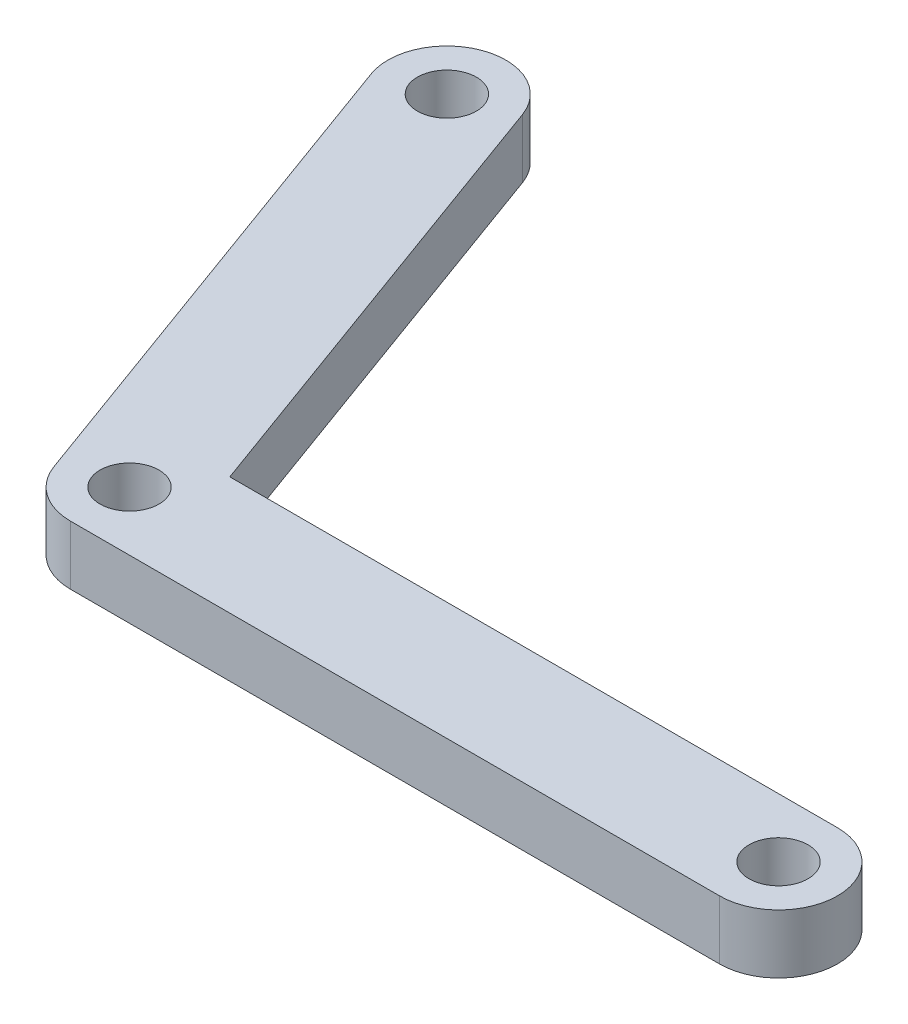
ISO-10303-21;
HEADER;
FILE_DESCRIPTION(('STEP AP214'),'2;1');
FILE_NAME('part.step','',(''),(''),'','','');
FILE_SCHEMA(('AUTOMOTIVE_DESIGN { 1 0 10303 214 1 1 1 1 }'));
ENDSEC;
DATA;
#1=APPLICATION_CONTEXT('core data for automotive mechanical design processes');
#2=APPLICATION_PROTOCOL_DEFINITION('international standard','automotive_design',2000,#1);
#3=PRODUCT_CONTEXT('',#1,'mechanical');
#4=PRODUCT('Part','Part','',(#3));
#5=PRODUCT_RELATED_PRODUCT_CATEGORY('part','',(#4));
#6=PRODUCT_DEFINITION_FORMATION('','',#4);
#7=PRODUCT_DEFINITION_CONTEXT('part definition',#1,'design');
#8=PRODUCT_DEFINITION('design','',#6,#7);
#9=PRODUCT_DEFINITION_SHAPE('','',#8);
#10=(LENGTH_UNIT() NAMED_UNIT(*) SI_UNIT(.MILLI.,.METRE.));
#11=(NAMED_UNIT(*) PLANE_ANGLE_UNIT() SI_UNIT($,.RADIAN.));
#12=(NAMED_UNIT(*) SI_UNIT($,.STERADIAN.) SOLID_ANGLE_UNIT());
#13=UNCERTAINTY_MEASURE_WITH_UNIT(LENGTH_MEASURE(1.E-05),#10,'distance_accuracy_value','');
#14=(GEOMETRIC_REPRESENTATION_CONTEXT(3) GLOBAL_UNCERTAINTY_ASSIGNED_CONTEXT((#13)) GLOBAL_UNIT_ASSIGNED_CONTEXT((#10,
#11,#12)) REPRESENTATION_CONTEXT('',''));
#15=CARTESIAN_POINT('',(0.,0.,0.));
#16=DIRECTION('',(0.,0.,1.));
#17=DIRECTION('',(1.,0.,0.));
#18=AXIS2_PLACEMENT_3D('',#15,#16,#17);
#19=CARTESIAN_POINT('',(-4.69846310392954,5.,1.71010071662837));
#20=DIRECTION('',(-0.939692620785907,0.,0.342020143325673));
#21=DIRECTION('',(0.342020143325673,0.,0.939692620785907));
#22=AXIS2_PLACEMENT_3D('',#19,#20,#21);
#23=PLANE('',#22);
#24=DIRECTION('',(-0.342020143325673,0.,-0.939692620785907));
#25=VECTOR('',#24,1.);
#26=CARTESIAN_POINT('',(-4.69846310392954,0.,1.71010071662837));
#27=LINE('',#26,#25);
#28=CARTESIAN_POINT('',(-4.69846310392954,0.,1.71010071662836));
#29=VERTEX_POINT('',#28);
#30=CARTESIAN_POINT('',(-20.0893695535848,0.,-40.5760672187374));
#31=VERTEX_POINT('',#30);
#32=EDGE_CURVE('E123',#29,#31,#27,.T.);
#33=ORIENTED_EDGE('',*,*,#32,.F.);
#34=DIRECTION('',(0.,-1.,0.));
#35=VECTOR('',#34,1.);
#36=CARTESIAN_POINT('',(-4.69846310392954,5.,1.71010071662836));
#37=LINE('',#36,#35);
#38=CARTESIAN_POINT('',(-4.69846310392954,5.,1.71010071662836));
#39=VERTEX_POINT('',#38);
#40=EDGE_CURVE('E11',#39,#29,#37,.T.);
#41=ORIENTED_EDGE('',*,*,#40,.F.);
#42=DIRECTION('',(-0.342020143325673,0.,-0.939692620785907));
#43=VECTOR('',#42,1.);
#44=CARTESIAN_POINT('',(-4.69846310392954,5.,1.71010071662837));
#45=LINE('',#44,#43);
#46=CARTESIAN_POINT('',(-20.0893695535848,5.,-40.5760672187374));
#47=VERTEX_POINT('',#46);
#48=EDGE_CURVE('E138',#39,#47,#45,.T.);
#49=ORIENTED_EDGE('',*,*,#48,.T.);
#50=DIRECTION('',(0.,-1.,0.));
#51=VECTOR('',#50,1.);
#52=CARTESIAN_POINT('',(-20.0893695535848,5.,-40.5760672187374));
#53=LINE('',#52,#51);
#54=EDGE_CURVE('E82',#47,#31,#53,.T.);
#55=ORIENTED_EDGE('',*,*,#54,.T.);
#56=EDGE_LOOP('',(#33,#41,#49,#55));
#57=FACE_BOUND('',#56,.T.);
#58=ADVANCED_FACE('F35',(#57),#23,.T.);
#59=CARTESIAN_POINT('',(0.,5.,0.));
#60=DIRECTION('',(0.,-1.,0.));
#61=DIRECTION('',(0.,0.,-1.));
#62=AXIS2_PLACEMENT_3D('',#59,#60,#61);
#63=CYLINDRICAL_SURFACE('',#62,5.);
#64=CARTESIAN_POINT('',(0.,0.,0.));
#65=DIRECTION('',(0.,1.,0.));
#66=DIRECTION('',(0.,0.,1.));
#67=AXIS2_PLACEMENT_3D('',#64,#65,#66);
#68=CIRCLE('',#67,5.);
#69=CARTESIAN_POINT('',(0.,0.,5.));
#70=VERTEX_POINT('',#69);
#71=EDGE_CURVE('E126',#29,#70,#68,.T.);
#72=ORIENTED_EDGE('',*,*,#71,.T.);
#73=DIRECTION('',(0.,-1.,0.));
#74=VECTOR('',#73,1.);
#75=CARTESIAN_POINT('',(0.,5.,5.));
#76=LINE('',#75,#74);
#77=CARTESIAN_POINT('',(0.,5.,5.));
#78=VERTEX_POINT('',#77);
#79=EDGE_CURVE('E43',#78,#70,#76,.T.);
#80=ORIENTED_EDGE('',*,*,#79,.F.);
#81=CARTESIAN_POINT('',(0.,5.,0.));
#82=DIRECTION('',(0.,1.,0.));
#83=DIRECTION('',(0.,0.,1.));
#84=AXIS2_PLACEMENT_3D('',#81,#82,#83);
#85=CIRCLE('',#84,5.);
#86=EDGE_CURVE('E174',#39,#78,#85,.T.);
#87=ORIENTED_EDGE('',*,*,#86,.F.);
#88=ORIENTED_EDGE('',*,*,#40,.T.);
#89=EDGE_LOOP('',(#72,#80,#87,#88));
#90=FACE_BOUND('',#89,.T.);
#91=ADVANCED_FACE('F165',(#90),#63,.T.);
#92=CARTESIAN_POINT('',(0.,5.,5.));
#93=DIRECTION('',(0.,0.,-1.));
#94=DIRECTION('',(-1.,0.,0.));
#95=AXIS2_PLACEMENT_3D('',#92,#93,#94);
#96=PLANE('',#95);
#97=DIRECTION('',(1.,0.,0.));
#98=VECTOR('',#97,1.);
#99=CARTESIAN_POINT('',(0.,0.,5.));
#100=LINE('',#99,#98);
#101=CARTESIAN_POINT('',(55.,0.,5.));
#102=VERTEX_POINT('',#101);
#103=EDGE_CURVE('E129',#70,#102,#100,.T.);
#104=ORIENTED_EDGE('',*,*,#103,.T.);
#105=DIRECTION('',(0.,-1.,0.));
#106=VECTOR('',#105,1.);
#107=CARTESIAN_POINT('',(55.,5.,5.));
#108=LINE('',#107,#106);
#109=CARTESIAN_POINT('',(55.,5.,5.));
#110=VERTEX_POINT('',#109);
#111=EDGE_CURVE('E142',#110,#102,#108,.T.);
#112=ORIENTED_EDGE('',*,*,#111,.F.);
#113=DIRECTION('',(1.,0.,0.));
#114=VECTOR('',#113,1.);
#115=CARTESIAN_POINT('',(0.,5.,5.));
#116=LINE('',#115,#114);
#117=EDGE_CURVE('E118',#78,#110,#116,.T.);
#118=ORIENTED_EDGE('',*,*,#117,.F.);
#119=ORIENTED_EDGE('',*,*,#79,.T.);
#120=EDGE_LOOP('',(#104,#112,#118,#119));
#121=FACE_BOUND('',#120,.T.);
#122=ADVANCED_FACE('F149',(#121),#96,.F.);
#123=CARTESIAN_POINT('',(55.,5.,0.));
#124=DIRECTION('',(0.,-1.,0.));
#125=DIRECTION('',(0.,0.,-1.));
#126=AXIS2_PLACEMENT_3D('',#123,#124,#125);
#127=CYLINDRICAL_SURFACE('',#126,5.);
#128=CARTESIAN_POINT('',(55.,0.,0.));
#129=DIRECTION('',(0.,1.,0.));
#130=DIRECTION('',(0.,0.,1.));
#131=AXIS2_PLACEMENT_3D('',#128,#129,#130);
#132=CIRCLE('',#131,5.);
#133=CARTESIAN_POINT('',(55.,0.,-5.));
#134=VERTEX_POINT('',#133);
#135=EDGE_CURVE('E131',#102,#134,#132,.T.);
#136=ORIENTED_EDGE('',*,*,#135,.T.);
#137=DIRECTION('',(0.,-1.,0.));
#138=VECTOR('',#137,1.);
#139=CARTESIAN_POINT('',(55.,5.,-5.));
#140=LINE('',#139,#138);
#141=CARTESIAN_POINT('',(55.,5.,-5.));
#142=VERTEX_POINT('',#141);
#143=EDGE_CURVE('E107',#142,#134,#140,.T.);
#144=ORIENTED_EDGE('',*,*,#143,.F.);
#145=CARTESIAN_POINT('',(55.,5.,0.));
#146=DIRECTION('',(0.,1.,0.));
#147=DIRECTION('',(0.,0.,1.));
#148=AXIS2_PLACEMENT_3D('',#145,#146,#147);
#149=CIRCLE('',#148,5.);
#150=EDGE_CURVE('E115',#110,#142,#149,.T.);
#151=ORIENTED_EDGE('',*,*,#150,.F.);
#152=ORIENTED_EDGE('',*,*,#111,.T.);
#153=EDGE_LOOP('',(#136,#144,#151,#152));
#154=FACE_BOUND('',#153,.T.);
#155=ADVANCED_FACE('F157',(#154),#127,.T.);
#156=CARTESIAN_POINT('',(0.,5.,-5.));
#157=DIRECTION('',(0.,0.,-1.));
#158=DIRECTION('',(-1.,0.,0.));
#159=AXIS2_PLACEMENT_3D('',#156,#157,#158);
#160=PLANE('',#159);
#161=DIRECTION('',(1.,0.,0.));
#162=VECTOR('',#161,1.);
#163=CARTESIAN_POINT('',(0.,0.,-5.));
#164=LINE('',#163,#162);
#165=CARTESIAN_POINT('',(3.50103769104853,0.,-5.));
#166=VERTEX_POINT('',#165);
#167=EDGE_CURVE('E106',#166,#134,#164,.T.);
#168=ORIENTED_EDGE('',*,*,#167,.F.);
#169=DIRECTION('',(0.,-1.,0.));
#170=VECTOR('',#169,1.);
#171=CARTESIAN_POINT('',(3.50103769104853,5.,-5.));
#172=LINE('',#171,#170);
#173=CARTESIAN_POINT('',(3.50103769104853,5.,-5.));
#174=VERTEX_POINT('',#173);
#175=EDGE_CURVE('E100',#174,#166,#172,.T.);
#176=ORIENTED_EDGE('',*,*,#175,.F.);
#177=DIRECTION('',(1.,0.,0.));
#178=VECTOR('',#177,1.);
#179=CARTESIAN_POINT('',(0.,5.,-5.));
#180=LINE('',#179,#178);
#181=EDGE_CURVE('E104',#174,#142,#180,.T.);
#182=ORIENTED_EDGE('',*,*,#181,.T.);
#183=ORIENTED_EDGE('',*,*,#143,.T.);
#184=EDGE_LOOP('',(#168,#176,#182,#183));
#185=FACE_BOUND('',#184,.T.);
#186=ADVANCED_FACE('F102',(#185),#160,.T.);
#187=CARTESIAN_POINT('',(4.69846310392954,5.,-1.71010071662836));
#188=DIRECTION('',(-0.939692620785907,0.,0.342020143325673));
#189=DIRECTION('',(0.342020143325673,0.,0.939692620785907));
#190=AXIS2_PLACEMENT_3D('',#187,#188,#189);
#191=PLANE('',#190);
#192=DIRECTION('',(-0.342020143325673,0.,-0.939692620785907));
#193=VECTOR('',#192,1.);
#194=CARTESIAN_POINT('',(4.69846310392954,0.,-1.71010071662836));
#195=LINE('',#194,#193);
#196=CARTESIAN_POINT('',(-10.6924433457257,0.,-43.9962686519942));
#197=VERTEX_POINT('',#196);
#198=EDGE_CURVE('E75',#166,#197,#195,.T.);
#199=ORIENTED_EDGE('',*,*,#198,.T.);
#200=DIRECTION('',(0.,-1.,0.));
#201=VECTOR('',#200,1.);
#202=CARTESIAN_POINT('',(-10.6924433457257,5.,-43.9962686519942));
#203=LINE('',#202,#201);
#204=CARTESIAN_POINT('',(-10.6924433457257,5.,-43.9962686519942));
#205=VERTEX_POINT('',#204);
#206=EDGE_CURVE('E108',#205,#197,#203,.T.);
#207=ORIENTED_EDGE('',*,*,#206,.F.);
#208=DIRECTION('',(-0.342020143325673,0.,-0.939692620785907));
#209=VECTOR('',#208,1.);
#210=CARTESIAN_POINT('',(4.69846310392954,5.,-1.71010071662836));
#211=LINE('',#210,#209);
#212=EDGE_CURVE('E110',#174,#205,#211,.T.);
#213=ORIENTED_EDGE('',*,*,#212,.F.);
#214=ORIENTED_EDGE('',*,*,#175,.T.);
#215=EDGE_LOOP('',(#199,#207,#213,#214));
#216=FACE_BOUND('',#215,.T.);
#217=ADVANCED_FACE('F111',(#216),#191,.F.);
#218=CARTESIAN_POINT('',(-15.3909064496553,5.,-42.2861679353658));
#219=DIRECTION('',(0.,-1.,0.));
#220=DIRECTION('',(0.,0.,-1.));
#221=AXIS2_PLACEMENT_3D('',#218,#219,#220);
#222=CYLINDRICAL_SURFACE('',#221,5.);
#223=CARTESIAN_POINT('',(-15.3909064496553,0.,-42.2861679353658));
#224=DIRECTION('',(0.,1.,0.));
#225=DIRECTION('',(0.,0.,1.));
#226=AXIS2_PLACEMENT_3D('',#223,#224,#225);
#227=CIRCLE('',#226,5.);
#228=EDGE_CURVE('E136',#197,#31,#227,.T.);
#229=ORIENTED_EDGE('',*,*,#228,.T.);
#230=ORIENTED_EDGE('',*,*,#54,.F.);
#231=CARTESIAN_POINT('',(-15.3909064496553,5.,-42.2861679353658));
#232=DIRECTION('',(0.,1.,0.));
#233=DIRECTION('',(0.,0.,1.));
#234=AXIS2_PLACEMENT_3D('',#231,#232,#233);
#235=CIRCLE('',#234,5.);
#236=EDGE_CURVE('E51',#205,#47,#235,.T.);
#237=ORIENTED_EDGE('',*,*,#236,.F.);
#238=ORIENTED_EDGE('',*,*,#206,.T.);
#239=EDGE_LOOP('',(#229,#230,#237,#238));
#240=FACE_BOUND('',#239,.T.);
#241=ADVANCED_FACE('F173',(#240),#222,.T.);
#242=CARTESIAN_POINT('',(0.,5.,0.));
#243=DIRECTION('',(0.,1.,0.));
#244=DIRECTION('',(0.,0.,1.));
#245=AXIS2_PLACEMENT_3D('',#242,#243,#244);
#246=PLANE('',#245);
#247=CARTESIAN_POINT('',(0.,5.,0.));
#248=DIRECTION('',(0.,1.,0.));
#249=DIRECTION('',(0.,0.,1.));
#250=AXIS2_PLACEMENT_3D('',#247,#248,#249);
#251=CIRCLE('',#250,2.5);
#252=CARTESIAN_POINT('',(0.,5.,2.5));
#253=VERTEX_POINT('',#252);
#254=EDGE_CURVE('E190',#253,#253,#251,.T.);
#255=ORIENTED_EDGE('',*,*,#254,.F.);
#256=EDGE_LOOP('',(#255));
#257=FACE_BOUND('',#256,.T.);
#258=CARTESIAN_POINT('',(-15.3909064496553,5.,-42.2861679353658));
#259=DIRECTION('',(0.,1.,0.));
#260=DIRECTION('',(0.,0.,1.));
#261=AXIS2_PLACEMENT_3D('',#258,#259,#260);
#262=CIRCLE('',#261,2.5);
#263=CARTESIAN_POINT('',(-15.3909064496553,5.,-39.7861679353658));
#264=VERTEX_POINT('',#263);
#265=EDGE_CURVE('E185',#264,#264,#262,.T.);
#266=ORIENTED_EDGE('',*,*,#265,.F.);
#267=EDGE_LOOP('',(#266));
#268=FACE_BOUND('',#267,.T.);
#269=CARTESIAN_POINT('',(55.,5.,0.));
#270=DIRECTION('',(0.,1.,0.));
#271=DIRECTION('',(0.,0.,1.));
#272=AXIS2_PLACEMENT_3D('',#269,#270,#271);
#273=CIRCLE('',#272,2.5);
#274=CARTESIAN_POINT('',(55.,5.,2.5));
#275=VERTEX_POINT('',#274);
#276=EDGE_CURVE('E178',#275,#275,#273,.T.);
#277=ORIENTED_EDGE('',*,*,#276,.F.);
#278=EDGE_LOOP('',(#277));
#279=FACE_BOUND('',#278,.T.);
#280=ORIENTED_EDGE('',*,*,#48,.F.);
#281=ORIENTED_EDGE('',*,*,#86,.T.);
#282=ORIENTED_EDGE('',*,*,#117,.T.);
#283=ORIENTED_EDGE('',*,*,#150,.T.);
#284=ORIENTED_EDGE('',*,*,#181,.F.);
#285=ORIENTED_EDGE('',*,*,#212,.T.);
#286=ORIENTED_EDGE('',*,*,#236,.T.);
#287=EDGE_LOOP('',(#280,#281,#282,#283,#284,#285,#286));
#288=FACE_BOUND('',#287,.T.);
#289=ADVANCED_FACE('F113',(#257,#268,#279,#288),#246,.T.);
#290=CARTESIAN_POINT('',(0.,0.,0.));
#291=DIRECTION('',(0.,1.,0.));
#292=DIRECTION('',(0.,0.,1.));
#293=AXIS2_PLACEMENT_3D('',#290,#291,#292);
#294=PLANE('',#293);
#295=CARTESIAN_POINT('',(0.,0.,0.));
#296=DIRECTION('',(0.,1.,0.));
#297=DIRECTION('',(0.,0.,1.));
#298=AXIS2_PLACEMENT_3D('',#295,#296,#297);
#299=CIRCLE('',#298,2.5);
#300=CARTESIAN_POINT('',(0.,0.,2.5));
#301=VERTEX_POINT('',#300);
#302=EDGE_CURVE('E182',#301,#301,#299,.T.);
#303=ORIENTED_EDGE('',*,*,#302,.T.);
#304=EDGE_LOOP('',(#303));
#305=FACE_BOUND('',#304,.T.);
#306=CARTESIAN_POINT('',(-15.3909064496553,0.,-42.2861679353658));
#307=DIRECTION('',(0.,1.,0.));
#308=DIRECTION('',(0.,0.,1.));
#309=AXIS2_PLACEMENT_3D('',#306,#307,#308);
#310=CIRCLE('',#309,2.5);
#311=CARTESIAN_POINT('',(-15.3909064496553,0.,-39.7861679353658));
#312=VERTEX_POINT('',#311);
#313=EDGE_CURVE('E127',#312,#312,#310,.T.);
#314=ORIENTED_EDGE('',*,*,#313,.T.);
#315=EDGE_LOOP('',(#314));
#316=FACE_BOUND('',#315,.T.);
#317=CARTESIAN_POINT('',(55.,0.,0.));
#318=DIRECTION('',(0.,1.,0.));
#319=DIRECTION('',(0.,0.,1.));
#320=AXIS2_PLACEMENT_3D('',#317,#318,#319);
#321=CIRCLE('',#320,2.5);
#322=CARTESIAN_POINT('',(55.,0.,2.5));
#323=VERTEX_POINT('',#322);
#324=EDGE_CURVE('E181',#323,#323,#321,.T.);
#325=ORIENTED_EDGE('',*,*,#324,.T.);
#326=EDGE_LOOP('',(#325));
#327=FACE_BOUND('',#326,.T.);
#328=ORIENTED_EDGE('',*,*,#32,.T.);
#329=ORIENTED_EDGE('',*,*,#228,.F.);
#330=ORIENTED_EDGE('',*,*,#198,.F.);
#331=ORIENTED_EDGE('',*,*,#167,.T.);
#332=ORIENTED_EDGE('',*,*,#135,.F.);
#333=ORIENTED_EDGE('',*,*,#103,.F.);
#334=ORIENTED_EDGE('',*,*,#71,.F.);
#335=EDGE_LOOP('',(#328,#329,#330,#331,#332,#333,#334));
#336=FACE_BOUND('',#335,.T.);
#337=ADVANCED_FACE('F155',(#305,#316,#327,#336),#294,.F.);
#338=CARTESIAN_POINT('',(55.,0.,0.));
#339=DIRECTION('',(0.,1.,0.));
#340=DIRECTION('',(0.,0.,1.));
#341=AXIS2_PLACEMENT_3D('',#338,#339,#340);
#342=CYLINDRICAL_SURFACE('',#341,2.5);
#343=ORIENTED_EDGE('',*,*,#324,.F.);
#344=EDGE_LOOP('',(#343));
#345=FACE_BOUND('',#344,.T.);
#346=ORIENTED_EDGE('',*,*,#276,.T.);
#347=EDGE_LOOP('',(#346));
#348=FACE_BOUND('',#347,.T.);
#349=ADVANCED_FACE('F212',(#345,#348),#342,.F.);
#350=CARTESIAN_POINT('',(-15.3909064496553,0.,-42.2861679353658));
#351=DIRECTION('',(0.,1.,0.));
#352=DIRECTION('',(0.,0.,1.));
#353=AXIS2_PLACEMENT_3D('',#350,#351,#352);
#354=CYLINDRICAL_SURFACE('',#353,2.5);
#355=ORIENTED_EDGE('',*,*,#313,.F.);
#356=EDGE_LOOP('',(#355));
#357=FACE_BOUND('',#356,.T.);
#358=ORIENTED_EDGE('',*,*,#265,.T.);
#359=EDGE_LOOP('',(#358));
#360=FACE_BOUND('',#359,.T.);
#361=ADVANCED_FACE('F201',(#357,#360),#354,.F.);
#362=CARTESIAN_POINT('',(0.,0.,0.));
#363=DIRECTION('',(0.,1.,0.));
#364=DIRECTION('',(0.,0.,1.));
#365=AXIS2_PLACEMENT_3D('',#362,#363,#364);
#366=CYLINDRICAL_SURFACE('',#365,2.5);
#367=ORIENTED_EDGE('',*,*,#302,.F.);
#368=EDGE_LOOP('',(#367));
#369=FACE_BOUND('',#368,.T.);
#370=ORIENTED_EDGE('',*,*,#254,.T.);
#371=EDGE_LOOP('',(#370));
#372=FACE_BOUND('',#371,.T.);
#373=ADVANCED_FACE('F198',(#369,#372),#366,.F.);
#374=CLOSED_SHELL('',(#58,#91,#122,#155,#186,#217,#241,#289,#337,#349,#361,#373));
#375=MANIFOLD_SOLID_BREP('B2',#374);
#376=ADVANCED_BREP_SHAPE_REPRESENTATION('',(#18,#375),#14);
#377=SHAPE_DEFINITION_REPRESENTATION(#9,#376);
ENDSEC;
END-ISO-10303-21;
